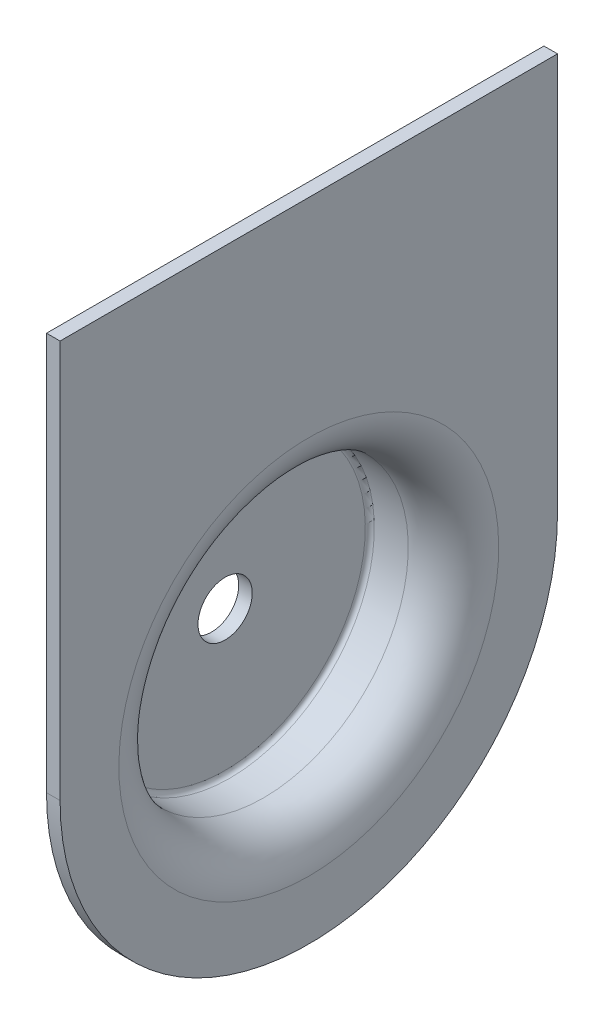
ISO-10303-21;
HEADER;
FILE_DESCRIPTION(('STEP AP214'),'2;1');
FILE_NAME('part.step','',(''),(''),'','','');
FILE_SCHEMA(('AUTOMOTIVE_DESIGN { 1 0 10303 214 1 1 1 1 }'));
ENDSEC;
DATA;
#1=APPLICATION_CONTEXT('core data for automotive mechanical design processes');
#2=APPLICATION_PROTOCOL_DEFINITION('international standard','automotive_design',2000,#1);
#3=PRODUCT_CONTEXT('',#1,'mechanical');
#4=PRODUCT('Part','Part','',(#3));
#5=PRODUCT_RELATED_PRODUCT_CATEGORY('part','',(#4));
#6=PRODUCT_DEFINITION_FORMATION('','',#4);
#7=PRODUCT_DEFINITION_CONTEXT('part definition',#1,'design');
#8=PRODUCT_DEFINITION('design','',#6,#7);
#9=PRODUCT_DEFINITION_SHAPE('','',#8);
#10=(LENGTH_UNIT() NAMED_UNIT(*) SI_UNIT(.MILLI.,.METRE.));
#11=(NAMED_UNIT(*) PLANE_ANGLE_UNIT() SI_UNIT($,.RADIAN.));
#12=(NAMED_UNIT(*) SI_UNIT($,.STERADIAN.) SOLID_ANGLE_UNIT());
#13=UNCERTAINTY_MEASURE_WITH_UNIT(LENGTH_MEASURE(1.E-05),#10,'distance_accuracy_value','');
#14=(GEOMETRIC_REPRESENTATION_CONTEXT(3) GLOBAL_UNCERTAINTY_ASSIGNED_CONTEXT((#13)) GLOBAL_UNIT_ASSIGNED_CONTEXT((#10,
#11,#12)) REPRESENTATION_CONTEXT('',''));
#15=CARTESIAN_POINT('',(0.,0.,0.));
#16=DIRECTION('',(0.,0.,1.));
#17=DIRECTION('',(1.,0.,0.));
#18=AXIS2_PLACEMENT_3D('',#15,#16,#17);
#19=CARTESIAN_POINT('',(71.9949493661167,-18.3727272727272,-50.));
#20=DIRECTION('',(-1.,0.,0.));
#21=DIRECTION('',(0.,-1.,0.));
#22=AXIS2_PLACEMENT_3D('',#19,#20,#21);
#23=CYLINDRICAL_SURFACE('',#22,35.);
#24=CARTESIAN_POINT('',(-48.5,-18.3727272727272,-50.));
#25=DIRECTION('',(1.,0.,0.));
#26=DIRECTION('',(0.,1.,0.));
#27=AXIS2_PLACEMENT_3D('',#24,#25,#26);
#28=CIRCLE('',#27,35.);
#29=CARTESIAN_POINT('',(-48.5,16.6272727272728,-50.));
#30=VERTEX_POINT('',#29);
#31=EDGE_CURVE('E153',#30,#30,#28,.T.);
#32=ORIENTED_EDGE('',*,*,#31,.T.);
#33=EDGE_LOOP('',(#32));
#34=FACE_BOUND('',#33,.T.);
#35=CARTESIAN_POINT('',(-43.,-18.3727272727272,-50.));
#36=DIRECTION('',(-1.,0.,0.));
#37=DIRECTION('',(0.,-1.,0.));
#38=AXIS2_PLACEMENT_3D('',#35,#36,#37);
#39=CIRCLE('',#38,35.);
#40=CARTESIAN_POINT('',(-43.,-53.3727272727272,-50.));
#41=VERTEX_POINT('',#40);
#42=EDGE_CURVE('E134',#41,#41,#39,.T.);
#43=ORIENTED_EDGE('',*,*,#42,.T.);
#44=EDGE_LOOP('',(#43));
#45=FACE_BOUND('',#44,.T.);
#46=ADVANCED_FACE('F40',(#34,#45),#23,.T.);
#47=CARTESIAN_POINT('',(71.9949493661167,-18.3727272727272,-50.));
#48=DIRECTION('',(-1.,0.,0.));
#49=DIRECTION('',(0.,-1.,0.));
#50=AXIS2_PLACEMENT_3D('',#47,#48,#49);
#51=CYLINDRICAL_SURFACE('',#50,32.);
#52=CARTESIAN_POINT('',(-47.5,-18.3727272727272,-50.));
#53=DIRECTION('',(1.,0.,0.));
#54=DIRECTION('',(0.,1.,0.));
#55=AXIS2_PLACEMENT_3D('',#52,#53,#54);
#56=CIRCLE('',#55,32.);
#57=CARTESIAN_POINT('',(-47.5,13.6272727272728,-50.));
#58=VERTEX_POINT('',#57);
#59=EDGE_CURVE('E12',#58,#58,#56,.F.);
#60=ORIENTED_EDGE('',*,*,#59,.T.);
#61=EDGE_LOOP('',(#60));
#62=FACE_BOUND('',#61,.T.);
#63=CARTESIAN_POINT('',(-40.,-18.3727272727272,-50.));
#64=DIRECTION('',(-1.,0.,0.));
#65=DIRECTION('',(0.,-1.,0.));
#66=AXIS2_PLACEMENT_3D('',#63,#64,#65);
#67=CIRCLE('',#66,32.);
#68=CARTESIAN_POINT('',(-40.,-50.3727272727272,-50.));
#69=VERTEX_POINT('',#68);
#70=EDGE_CURVE('E149',#69,#69,#67,.F.);
#71=ORIENTED_EDGE('',*,*,#70,.T.);
#72=EDGE_LOOP('',(#71));
#73=FACE_BOUND('',#72,.T.);
#74=ADVANCED_FACE('F177',(#62,#73),#51,.F.);
#75=CARTESIAN_POINT('',(-30.,-18.3727272727272,-45.));
#76=DIRECTION('',(-1.,0.,0.));
#77=DIRECTION('',(0.,-1.,0.));
#78=AXIS2_PLACEMENT_3D('',#75,#76,#77);
#79=PLANE('',#78);
#80=CARTESIAN_POINT('',(-30.,-18.3727272727272,-50.));
#81=DIRECTION('',(-1.,0.,0.));
#82=DIRECTION('',(0.,-1.,0.));
#83=AXIS2_PLACEMENT_3D('',#80,#81,#82);
#84=CIRCLE('',#83,42.);
#85=CARTESIAN_POINT('',(-30.,-60.3727272727272,-50.));
#86=VERTEX_POINT('',#85);
#87=EDGE_CURVE('E145',#86,#86,#84,.T.);
#88=ORIENTED_EDGE('',*,*,#87,.T.);
#89=EDGE_LOOP('',(#88));
#90=FACE_BOUND('',#89,.T.);
#91=CARTESIAN_POINT('',(-30.,-18.3727272727272,-50.));
#92=DIRECTION('',(-1.,0.,0.));
#93=DIRECTION('',(0.,-1.,0.));
#94=AXIS2_PLACEMENT_3D('',#91,#92,#93);
#95=CIRCLE('',#94,55.);
#96=CARTESIAN_POINT('',(-30.,-18.3727272727273,-105.));
#97=VERTEX_POINT('',#96);
#98=CARTESIAN_POINT('',(-30.,-18.3727272727273,5.00000000000001));
#99=VERTEX_POINT('',#98);
#100=EDGE_CURVE('E113',#97,#99,#95,.T.);
#101=ORIENTED_EDGE('',*,*,#100,.F.);
#102=DIRECTION('',(0.,-1.,0.));
#103=VECTOR('',#102,1.);
#104=CARTESIAN_POINT('',(-30.,-18.3727272727273,-105.));
#105=LINE('',#104,#103);
#106=CARTESIAN_POINT('',(-29.9999999999999,69.6272727272728,-105.));
#107=VERTEX_POINT('',#106);
#108=EDGE_CURVE('E81',#107,#97,#105,.T.);
#109=ORIENTED_EDGE('',*,*,#108,.F.);
#110=DIRECTION('',(0.,0.,-1.));
#111=VECTOR('',#110,1.);
#112=CARTESIAN_POINT('',(-29.9999999999999,69.6272727272728,-105.));
#113=LINE('',#112,#111);
#114=CARTESIAN_POINT('',(-29.9999999999999,69.6272727272728,5.00000000000001));
#115=VERTEX_POINT('',#114);
#116=EDGE_CURVE('E75',#115,#107,#113,.T.);
#117=ORIENTED_EDGE('',*,*,#116,.F.);
#118=DIRECTION('',(0.,1.,0.));
#119=VECTOR('',#118,1.);
#120=CARTESIAN_POINT('',(-29.9999999999999,69.6272727272728,5.00000000000001));
#121=LINE('',#120,#119);
#122=EDGE_CURVE('E100',#99,#115,#121,.T.);
#123=ORIENTED_EDGE('',*,*,#122,.F.);
#124=EDGE_LOOP('',(#101,#109,#117,#123));
#125=FACE_BOUND('',#124,.T.);
#126=ADVANCED_FACE('F183',(#90,#125),#79,.F.);
#127=CARTESIAN_POINT('',(-48.5,-18.3727272727272,-50.));
#128=DIRECTION('',(1.,0.,0.));
#129=DIRECTION('',(0.,1.,0.));
#130=AXIS2_PLACEMENT_3D('',#127,#128,#129);
#131=PLANE('',#130);
#132=CARTESIAN_POINT('',(-48.5,-18.3727272727272,-50.));
#133=DIRECTION('',(1.,0.,0.));
#134=DIRECTION('',(0.,1.,0.));
#135=AXIS2_PLACEMENT_3D('',#132,#133,#134);
#136=CIRCLE('',#135,31.);
#137=CARTESIAN_POINT('',(-48.5,12.6272727272728,-50.));
#138=VERTEX_POINT('',#137);
#139=EDGE_CURVE('E50',#138,#138,#136,.T.);
#140=ORIENTED_EDGE('',*,*,#139,.T.);
#141=EDGE_LOOP('',(#140));
#142=FACE_BOUND('',#141,.T.);
#143=CARTESIAN_POINT('',(-48.5,-18.3727272727272,-50.));
#144=DIRECTION('',(1.,0.,0.));
#145=DIRECTION('',(0.,1.,0.));
#146=AXIS2_PLACEMENT_3D('',#143,#144,#145);
#147=CIRCLE('',#146,6.);
#148=CARTESIAN_POINT('',(-48.5,-12.3727272727272,-50.));
#149=VERTEX_POINT('',#148);
#150=EDGE_CURVE('E129',#149,#149,#147,.T.);
#151=ORIENTED_EDGE('',*,*,#150,.F.);
#152=EDGE_LOOP('',(#151));
#153=FACE_BOUND('',#152,.T.);
#154=ADVANCED_FACE('F164',(#142,#153),#131,.T.);
#155=CARTESIAN_POINT('',(-51.5,-18.3727272727272,-50.));
#156=DIRECTION('',(1.,0.,0.));
#157=DIRECTION('',(0.,1.,0.));
#158=AXIS2_PLACEMENT_3D('',#155,#156,#157);
#159=PLANE('',#158);
#160=CARTESIAN_POINT('',(-51.5,-18.3727272727272,-50.));
#161=DIRECTION('',(1.,0.,0.));
#162=DIRECTION('',(0.,1.,0.));
#163=AXIS2_PLACEMENT_3D('',#160,#161,#162);
#164=CIRCLE('',#163,32.);
#165=CARTESIAN_POINT('',(-51.5,13.6272727272728,-50.));
#166=VERTEX_POINT('',#165);
#167=EDGE_CURVE('E157',#166,#166,#164,.F.);
#168=ORIENTED_EDGE('',*,*,#167,.T.);
#169=EDGE_LOOP('',(#168));
#170=FACE_BOUND('',#169,.T.);
#171=CARTESIAN_POINT('',(-51.5,-18.3727272727272,-50.));
#172=DIRECTION('',(1.,0.,0.));
#173=DIRECTION('',(0.,1.,0.));
#174=AXIS2_PLACEMENT_3D('',#171,#172,#173);
#175=CIRCLE('',#174,6.);
#176=CARTESIAN_POINT('',(-51.5,-12.3727272727272,-50.));
#177=VERTEX_POINT('',#176);
#178=EDGE_CURVE('E130',#177,#177,#175,.T.);
#179=ORIENTED_EDGE('',*,*,#178,.T.);
#180=EDGE_LOOP('',(#179));
#181=FACE_BOUND('',#180,.T.);
#182=ADVANCED_FACE('F223',(#170,#181),#159,.F.);
#183=CARTESIAN_POINT('',(-51.5,-18.3727272727272,-50.));
#184=DIRECTION('',(1.,0.,0.));
#185=DIRECTION('',(0.,1.,0.));
#186=AXIS2_PLACEMENT_3D('',#183,#184,#185);
#187=CYLINDRICAL_SURFACE('',#186,6.);
#188=ORIENTED_EDGE('',*,*,#178,.F.);
#189=EDGE_LOOP('',(#188));
#190=FACE_BOUND('',#189,.T.);
#191=ORIENTED_EDGE('',*,*,#150,.T.);
#192=EDGE_LOOP('',(#191));
#193=FACE_BOUND('',#192,.T.);
#194=ADVANCED_FACE('F221',(#190,#193),#187,.F.);
#195=CARTESIAN_POINT('',(-33.,-18.3727272727272,-50.));
#196=DIRECTION('',(-1.,0.,0.));
#197=DIRECTION('',(0.,-1.,0.));
#198=AXIS2_PLACEMENT_3D('',#195,#196,#197);
#199=PLANE('',#198);
#200=CARTESIAN_POINT('',(-33.,-18.3727272727272,-50.));
#201=DIRECTION('',(-1.,0.,0.));
#202=DIRECTION('',(0.,-1.,0.));
#203=AXIS2_PLACEMENT_3D('',#200,#201,#202);
#204=CIRCLE('',#203,45.);
#205=CARTESIAN_POINT('',(-33.,-63.3727272727272,-50.));
#206=VERTEX_POINT('',#205);
#207=EDGE_CURVE('E141',#206,#206,#204,.F.);
#208=ORIENTED_EDGE('',*,*,#207,.T.);
#209=EDGE_LOOP('',(#208));
#210=FACE_BOUND('',#209,.T.);
#211=CARTESIAN_POINT('',(-33.,-18.3727272727272,-50.));
#212=DIRECTION('',(-1.,0.,0.));
#213=DIRECTION('',(0.,-1.,0.));
#214=AXIS2_PLACEMENT_3D('',#211,#212,#213);
#215=CIRCLE('',#214,55.);
#216=CARTESIAN_POINT('',(-33.,-18.3727272727272,-105.));
#217=VERTEX_POINT('',#216);
#218=CARTESIAN_POINT('',(-33.,-18.3727272727272,5.00000000000001));
#219=VERTEX_POINT('',#218);
#220=EDGE_CURVE('E94',#217,#219,#215,.T.);
#221=ORIENTED_EDGE('',*,*,#220,.T.);
#222=DIRECTION('',(0.,1.,0.));
#223=VECTOR('',#222,1.);
#224=CARTESIAN_POINT('',(-32.9999999999999,69.6272727272728,5.00000000000001));
#225=LINE('',#224,#223);
#226=CARTESIAN_POINT('',(-32.9999999999999,69.6272727272728,5.00000000000001));
#227=VERTEX_POINT('',#226);
#228=EDGE_CURVE('E89',#219,#227,#225,.T.);
#229=ORIENTED_EDGE('',*,*,#228,.T.);
#230=DIRECTION('',(0.,0.,-1.));
#231=VECTOR('',#230,1.);
#232=CARTESIAN_POINT('',(-32.9999999999999,69.6272727272728,-105.));
#233=LINE('',#232,#231);
#234=CARTESIAN_POINT('',(-32.9999999999999,69.6272727272728,-105.));
#235=VERTEX_POINT('',#234);
#236=EDGE_CURVE('E92',#227,#235,#233,.T.);
#237=ORIENTED_EDGE('',*,*,#236,.T.);
#238=DIRECTION('',(0.,-1.,0.));
#239=VECTOR('',#238,1.);
#240=CARTESIAN_POINT('',(-33.,-18.3727272727272,-105.));
#241=LINE('',#240,#239);
#242=EDGE_CURVE('E58',#235,#217,#241,.T.);
#243=ORIENTED_EDGE('',*,*,#242,.T.);
#244=EDGE_LOOP('',(#221,#229,#237,#243));
#245=FACE_BOUND('',#244,.T.);
#246=ADVANCED_FACE('F90',(#210,#245),#199,.T.);
#247=CARTESIAN_POINT('',(-33.,-18.3727272727272,-50.));
#248=DIRECTION('',(1.,0.,0.));
#249=DIRECTION('',(0.,1.,0.));
#250=AXIS2_PLACEMENT_3D('',#247,#248,#249);
#251=CYLINDRICAL_SURFACE('',#250,55.);
#252=ORIENTED_EDGE('',*,*,#100,.T.);
#253=DIRECTION('',(1.,0.,0.));
#254=VECTOR('',#253,1.);
#255=CARTESIAN_POINT('',(-33.,-18.3727272727272,5.00000000000001));
#256=LINE('',#255,#254);
#257=EDGE_CURVE('E102',#219,#99,#256,.T.);
#258=ORIENTED_EDGE('',*,*,#257,.F.);
#259=ORIENTED_EDGE('',*,*,#220,.F.);
#260=DIRECTION('',(1.,0.,0.));
#261=VECTOR('',#260,1.);
#262=CARTESIAN_POINT('',(-33.,-18.3727272727272,-105.));
#263=LINE('',#262,#261);
#264=EDGE_CURVE('E109',#217,#97,#263,.T.);
#265=ORIENTED_EDGE('',*,*,#264,.T.);
#266=EDGE_LOOP('',(#252,#258,#259,#265));
#267=FACE_BOUND('',#266,.T.);
#268=ADVANCED_FACE('F208',(#267),#251,.T.);
#269=CARTESIAN_POINT('',(-32.9999999999999,69.6272727272728,5.00000000000001));
#270=DIRECTION('',(0.,0.,-1.));
#271=DIRECTION('',(-1.,0.,0.));
#272=AXIS2_PLACEMENT_3D('',#269,#270,#271);
#273=PLANE('',#272);
#274=ORIENTED_EDGE('',*,*,#122,.T.);
#275=DIRECTION('',(1.,0.,0.));
#276=VECTOR('',#275,1.);
#277=CARTESIAN_POINT('',(-32.9999999999999,69.6272727272728,5.00000000000001));
#278=LINE('',#277,#276);
#279=EDGE_CURVE('E98',#227,#115,#278,.T.);
#280=ORIENTED_EDGE('',*,*,#279,.F.);
#281=ORIENTED_EDGE('',*,*,#228,.F.);
#282=ORIENTED_EDGE('',*,*,#257,.T.);
#283=EDGE_LOOP('',(#274,#280,#281,#282));
#284=FACE_BOUND('',#283,.T.);
#285=ADVANCED_FACE('F99',(#284),#273,.F.);
#286=CARTESIAN_POINT('',(-32.9999999999999,69.6272727272728,-105.));
#287=DIRECTION('',(0.,-1.,0.));
#288=DIRECTION('',(1.,0.,0.));
#289=AXIS2_PLACEMENT_3D('',#286,#287,#288);
#290=PLANE('',#289);
#291=ORIENTED_EDGE('',*,*,#116,.T.);
#292=DIRECTION('',(1.,0.,0.));
#293=VECTOR('',#292,1.);
#294=CARTESIAN_POINT('',(-32.9999999999999,69.6272727272728,-105.));
#295=LINE('',#294,#293);
#296=EDGE_CURVE('E103',#235,#107,#295,.T.);
#297=ORIENTED_EDGE('',*,*,#296,.F.);
#298=ORIENTED_EDGE('',*,*,#236,.F.);
#299=ORIENTED_EDGE('',*,*,#279,.T.);
#300=EDGE_LOOP('',(#291,#297,#298,#299));
#301=FACE_BOUND('',#300,.T.);
#302=ADVANCED_FACE('F105',(#301),#290,.F.);
#303=CARTESIAN_POINT('',(-33.,-18.3727272727272,-105.));
#304=DIRECTION('',(0.,0.,1.));
#305=DIRECTION('',(1.,0.,0.));
#306=AXIS2_PLACEMENT_3D('',#303,#304,#305);
#307=PLANE('',#306);
#308=ORIENTED_EDGE('',*,*,#108,.T.);
#309=ORIENTED_EDGE('',*,*,#264,.F.);
#310=ORIENTED_EDGE('',*,*,#242,.F.);
#311=ORIENTED_EDGE('',*,*,#296,.T.);
#312=EDGE_LOOP('',(#308,#309,#310,#311));
#313=FACE_BOUND('',#312,.T.);
#314=ADVANCED_FACE('F196',(#313),#307,.F.);
#315=CARTESIAN_POINT('',(-43.,-18.3727272727272,-50.));
#316=DIRECTION('',(-1.,0.,0.));
#317=DIRECTION('',(0.,-1.,0.));
#318=AXIS2_PLACEMENT_3D('',#315,#316,#317);
#319=TOROIDAL_SURFACE('',#318,45.,10.);
#320=ORIENTED_EDGE('',*,*,#207,.F.);
#321=EDGE_LOOP('',(#320));
#322=FACE_BOUND('',#321,.T.);
#323=ORIENTED_EDGE('',*,*,#42,.F.);
#324=EDGE_LOOP('',(#323));
#325=FACE_BOUND('',#324,.T.);
#326=ADVANCED_FACE('F193',(#322,#325),#319,.F.);
#327=CARTESIAN_POINT('',(-40.,-18.3727272727272,-50.));
#328=DIRECTION('',(-1.,0.,0.));
#329=DIRECTION('',(0.,-1.,0.));
#330=AXIS2_PLACEMENT_3D('',#327,#328,#329);
#331=TOROIDAL_SURFACE('',#330,42.,10.);
#332=ORIENTED_EDGE('',*,*,#70,.F.);
#333=EDGE_LOOP('',(#332));
#334=FACE_BOUND('',#333,.T.);
#335=ORIENTED_EDGE('',*,*,#87,.F.);
#336=EDGE_LOOP('',(#335));
#337=FACE_BOUND('',#336,.T.);
#338=ADVANCED_FACE('F173',(#334,#337),#331,.T.);
#339=CARTESIAN_POINT('',(-48.5,-18.3727272727272,-50.));
#340=DIRECTION('',(1.,0.,0.));
#341=DIRECTION('',(0.,1.,0.));
#342=AXIS2_PLACEMENT_3D('',#339,#340,#341);
#343=TOROIDAL_SURFACE('',#342,32.,3.);
#344=ORIENTED_EDGE('',*,*,#167,.F.);
#345=EDGE_LOOP('',(#344));
#346=FACE_BOUND('',#345,.T.);
#347=ORIENTED_EDGE('',*,*,#31,.F.);
#348=EDGE_LOOP('',(#347));
#349=FACE_BOUND('',#348,.T.);
#350=ADVANCED_FACE('F168',(#346,#349),#343,.T.);
#351=CARTESIAN_POINT('',(-47.5,-18.3727272727272,-50.));
#352=DIRECTION('',(1.,0.,0.));
#353=DIRECTION('',(0.,1.,0.));
#354=AXIS2_PLACEMENT_3D('',#351,#352,#353);
#355=TOROIDAL_SURFACE('',#354,31.,1.);
#356=ORIENTED_EDGE('',*,*,#59,.F.);
#357=EDGE_LOOP('',(#356));
#358=FACE_BOUND('',#357,.T.);
#359=ORIENTED_EDGE('',*,*,#139,.F.);
#360=EDGE_LOOP('',(#359));
#361=FACE_BOUND('',#360,.T.);
#362=ADVANCED_FACE('F42',(#358,#361),#355,.F.);
#363=CLOSED_SHELL('',(#46,#74,#126,#154,#182,#194,#246,#268,#285,#302,#314,#326,#338,#350,#362));
#364=MANIFOLD_SOLID_BREP('B2',#363);
#365=ADVANCED_BREP_SHAPE_REPRESENTATION('',(#18,#364),#14);
#366=SHAPE_DEFINITION_REPRESENTATION(#9,#365);
ENDSEC;
END-ISO-10303-21;
